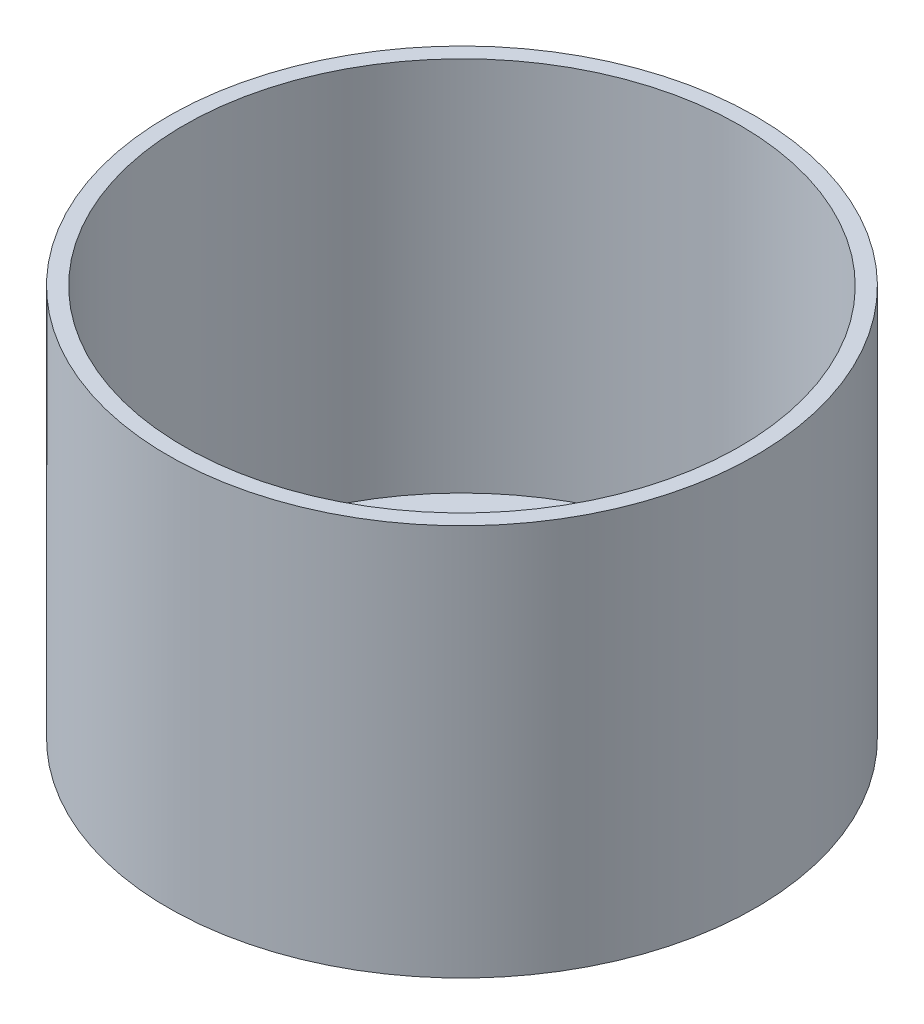
ISO-10303-21;
HEADER;
FILE_DESCRIPTION(('STEP AP214'),'2;1');
FILE_NAME('part.step','',(''),(''),'','','');
FILE_SCHEMA(('AUTOMOTIVE_DESIGN { 1 0 10303 214 1 1 1 1 }'));
ENDSEC;
DATA;
#1=APPLICATION_CONTEXT('core data for automotive mechanical design processes');
#2=APPLICATION_PROTOCOL_DEFINITION('international standard','automotive_design',2000,#1);
#3=PRODUCT_CONTEXT('',#1,'mechanical');
#4=PRODUCT('Part','Part','',(#3));
#5=PRODUCT_RELATED_PRODUCT_CATEGORY('part','',(#4));
#6=PRODUCT_DEFINITION_FORMATION('','',#4);
#7=PRODUCT_DEFINITION_CONTEXT('part definition',#1,'design');
#8=PRODUCT_DEFINITION('design','',#6,#7);
#9=PRODUCT_DEFINITION_SHAPE('','',#8);
#10=(LENGTH_UNIT() NAMED_UNIT(*) SI_UNIT(.MILLI.,.METRE.));
#11=(NAMED_UNIT(*) PLANE_ANGLE_UNIT() SI_UNIT($,.RADIAN.));
#12=(NAMED_UNIT(*) SI_UNIT($,.STERADIAN.) SOLID_ANGLE_UNIT());
#13=UNCERTAINTY_MEASURE_WITH_UNIT(LENGTH_MEASURE(1.E-05),#10,'distance_accuracy_value','');
#14=(GEOMETRIC_REPRESENTATION_CONTEXT(3) GLOBAL_UNCERTAINTY_ASSIGNED_CONTEXT((#13)) GLOBAL_UNIT_ASSIGNED_CONTEXT((#10,
#11,#12)) REPRESENTATION_CONTEXT('',''));
#15=CARTESIAN_POINT('',(0.,0.,0.));
#16=DIRECTION('',(0.,0.,1.));
#17=DIRECTION('',(1.,0.,0.));
#18=AXIS2_PLACEMENT_3D('',#15,#16,#17);
#19=CARTESIAN_POINT('',(-15.,17.7,0.));
#20=DIRECTION('',(0.,1.,0.));
#21=DIRECTION('',(0.,0.,1.));
#22=AXIS2_PLACEMENT_3D('',#19,#20,#21);
#23=PLANE('',#22);
#24=CARTESIAN_POINT('',(0.,17.7,0.));
#25=DIRECTION('',(0.,1.,0.));
#26=DIRECTION('',(0.,0.,1.));
#27=AXIS2_PLACEMENT_3D('',#24,#25,#26);
#28=CIRCLE('',#27,4.);
#29=CARTESIAN_POINT('',(0.,17.7,4.));
#30=VERTEX_POINT('',#29);
#31=EDGE_CURVE('E50',#30,#30,#28,.T.);
#32=ORIENTED_EDGE('',*,*,#31,.T.);
#33=EDGE_LOOP('',(#32));
#34=FACE_BOUND('',#33,.T.);
#35=CARTESIAN_POINT('',(0.,17.7,0.));
#36=DIRECTION('',(0.,-1.,0.));
#37=DIRECTION('',(0.,0.,-1.));
#38=AXIS2_PLACEMENT_3D('',#35,#36,#37);
#39=CIRCLE('',#38,15.);
#40=CARTESIAN_POINT('',(0.,17.7,-15.));
#41=VERTEX_POINT('',#40);
#42=EDGE_CURVE('E10',#41,#41,#39,.T.);
#43=ORIENTED_EDGE('',*,*,#42,.T.);
#44=EDGE_LOOP('',(#43));
#45=FACE_BOUND('',#44,.T.);
#46=ADVANCED_FACE('F31',(#34,#45),#23,.F.);
#47=CARTESIAN_POINT('',(0.,0.,0.));
#48=DIRECTION('',(0.,-1.,0.));
#49=DIRECTION('',(0.,0.,-1.));
#50=AXIS2_PLACEMENT_3D('',#47,#48,#49);
#51=CYLINDRICAL_SURFACE('',#50,15.);
#52=ORIENTED_EDGE('',*,*,#42,.F.);
#53=EDGE_LOOP('',(#52));
#54=FACE_BOUND('',#53,.T.);
#55=CARTESIAN_POINT('',(0.,37.7,0.));
#56=DIRECTION('',(0.,-1.,0.));
#57=DIRECTION('',(0.,0.,-1.));
#58=AXIS2_PLACEMENT_3D('',#55,#56,#57);
#59=CIRCLE('',#58,15.);
#60=CARTESIAN_POINT('',(0.,37.7,-15.));
#61=VERTEX_POINT('',#60);
#62=EDGE_CURVE('E37',#61,#61,#59,.T.);
#63=ORIENTED_EDGE('',*,*,#62,.T.);
#64=EDGE_LOOP('',(#63));
#65=FACE_BOUND('',#64,.T.);
#66=ADVANCED_FACE('F74',(#54,#65),#51,.T.);
#67=CARTESIAN_POINT('',(-15.,37.7,0.));
#68=DIRECTION('',(0.,-1.,0.));
#69=DIRECTION('',(0.,0.,-1.));
#70=AXIS2_PLACEMENT_3D('',#67,#68,#69);
#71=PLANE('',#70);
#72=ORIENTED_EDGE('',*,*,#62,.F.);
#73=EDGE_LOOP('',(#72));
#74=FACE_BOUND('',#73,.T.);
#75=CARTESIAN_POINT('',(0.,37.7,0.));
#76=DIRECTION('',(0.,-1.,0.));
#77=DIRECTION('',(0.,0.,-1.));
#78=AXIS2_PLACEMENT_3D('',#75,#76,#77);
#79=CIRCLE('',#78,14.2);
#80=CARTESIAN_POINT('',(0.,37.7,-14.2));
#81=VERTEX_POINT('',#80);
#82=EDGE_CURVE('E41',#81,#81,#79,.T.);
#83=ORIENTED_EDGE('',*,*,#82,.T.);
#84=EDGE_LOOP('',(#83));
#85=FACE_BOUND('',#84,.T.);
#86=ADVANCED_FACE('F68',(#74,#85),#71,.F.);
#87=CARTESIAN_POINT('',(0.,0.,0.));
#88=DIRECTION('',(0.,-1.,0.));
#89=DIRECTION('',(0.,0.,-1.));
#90=AXIS2_PLACEMENT_3D('',#87,#88,#89);
#91=CYLINDRICAL_SURFACE('',#90,14.2);
#92=ORIENTED_EDGE('',*,*,#82,.F.);
#93=EDGE_LOOP('',(#92));
#94=FACE_BOUND('',#93,.T.);
#95=CARTESIAN_POINT('',(0.,18.5,0.));
#96=DIRECTION('',(0.,-1.,0.));
#97=DIRECTION('',(0.,0.,-1.));
#98=AXIS2_PLACEMENT_3D('',#95,#96,#97);
#99=CIRCLE('',#98,14.2);
#100=CARTESIAN_POINT('',(0.,18.5,-14.2));
#101=VERTEX_POINT('',#100);
#102=EDGE_CURVE('E45',#101,#101,#99,.T.);
#103=ORIENTED_EDGE('',*,*,#102,.T.);
#104=EDGE_LOOP('',(#103));
#105=FACE_BOUND('',#104,.T.);
#106=ADVANCED_FACE('F63',(#94,#105),#91,.F.);
#107=CARTESIAN_POINT('',(-14.2,18.5,0.));
#108=DIRECTION('',(0.,-1.,0.));
#109=DIRECTION('',(0.,0.,-1.));
#110=AXIS2_PLACEMENT_3D('',#107,#108,#109);
#111=PLANE('',#110);
#112=CARTESIAN_POINT('',(0.,18.5,0.));
#113=DIRECTION('',(0.,1.,0.));
#114=DIRECTION('',(0.,0.,1.));
#115=AXIS2_PLACEMENT_3D('',#112,#113,#114);
#116=CIRCLE('',#115,4.);
#117=CARTESIAN_POINT('',(0.,18.5,4.));
#118=VERTEX_POINT('',#117);
#119=EDGE_CURVE('E53',#118,#118,#116,.T.);
#120=ORIENTED_EDGE('',*,*,#119,.F.);
#121=EDGE_LOOP('',(#120));
#122=FACE_BOUND('',#121,.T.);
#123=ORIENTED_EDGE('',*,*,#102,.F.);
#124=EDGE_LOOP('',(#123));
#125=FACE_BOUND('',#124,.T.);
#126=ADVANCED_FACE('F60',(#122,#125),#111,.F.);
#127=CARTESIAN_POINT('',(0.,8.5,0.));
#128=DIRECTION('',(0.,1.,0.));
#129=DIRECTION('',(0.,0.,1.));
#130=AXIS2_PLACEMENT_3D('',#127,#128,#129);
#131=CYLINDRICAL_SURFACE('',#130,4.);
#132=ORIENTED_EDGE('',*,*,#119,.T.);
#133=EDGE_LOOP('',(#132));
#134=FACE_BOUND('',#133,.T.);
#135=ORIENTED_EDGE('',*,*,#31,.F.);
#136=EDGE_LOOP('',(#135));
#137=FACE_BOUND('',#136,.T.);
#138=ADVANCED_FACE('F57',(#134,#137),#131,.F.);
#139=CLOSED_SHELL('',(#46,#66,#86,#106,#126,#138));
#140=MANIFOLD_SOLID_BREP('B2',#139);
#141=ADVANCED_BREP_SHAPE_REPRESENTATION('',(#18,#140),#14);
#142=SHAPE_DEFINITION_REPRESENTATION(#9,#141);
ENDSEC;
END-ISO-10303-21;
